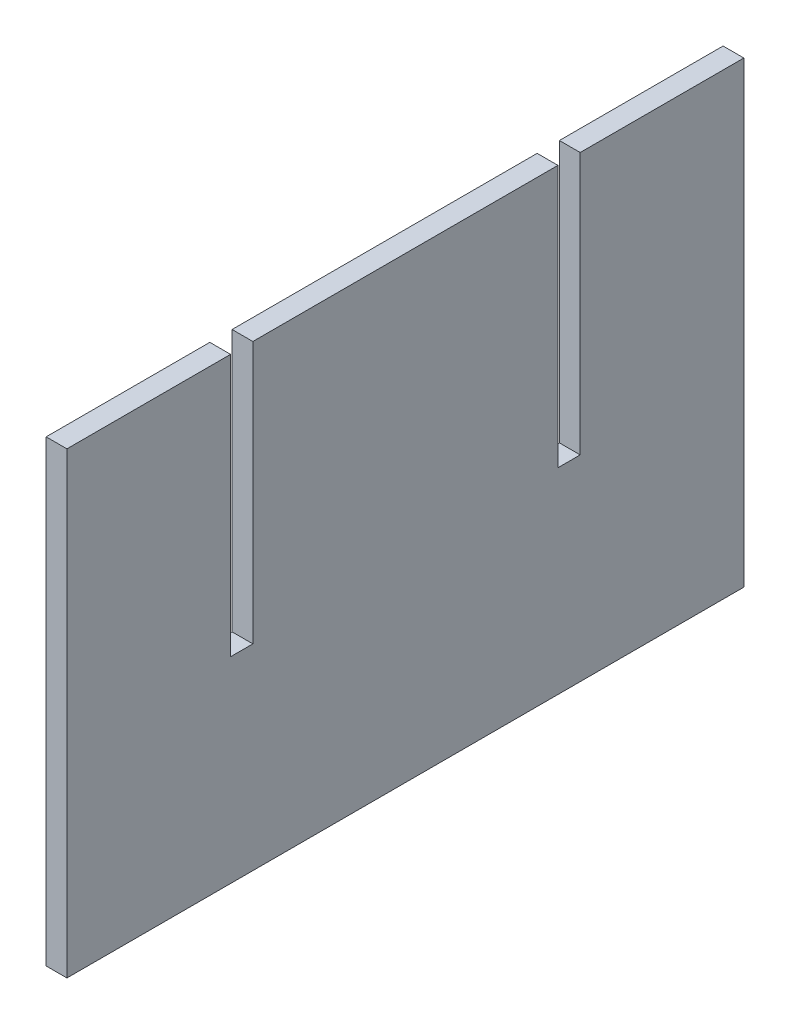
ISO-10303-21;
HEADER;
FILE_DESCRIPTION(('STEP AP214'),'2;1');
FILE_NAME('part.step','',(''),(''),'','','');
FILE_SCHEMA(('AUTOMOTIVE_DESIGN { 1 0 10303 214 1 1 1 1 }'));
ENDSEC;
DATA;
#1=APPLICATION_CONTEXT('core data for automotive mechanical design processes');
#2=APPLICATION_PROTOCOL_DEFINITION('international standard','automotive_design',2000,#1);
#3=PRODUCT_CONTEXT('',#1,'mechanical');
#4=PRODUCT('Part','Part','',(#3));
#5=PRODUCT_RELATED_PRODUCT_CATEGORY('part','',(#4));
#6=PRODUCT_DEFINITION_FORMATION('','',#4);
#7=PRODUCT_DEFINITION_CONTEXT('part definition',#1,'design');
#8=PRODUCT_DEFINITION('design','',#6,#7);
#9=PRODUCT_DEFINITION_SHAPE('','',#8);
#10=(LENGTH_UNIT() NAMED_UNIT(*) SI_UNIT(.MILLI.,.METRE.));
#11=(NAMED_UNIT(*) PLANE_ANGLE_UNIT() SI_UNIT($,.RADIAN.));
#12=(NAMED_UNIT(*) SI_UNIT($,.STERADIAN.) SOLID_ANGLE_UNIT());
#13=UNCERTAINTY_MEASURE_WITH_UNIT(LENGTH_MEASURE(1.E-05),#10,'distance_accuracy_value','');
#14=(GEOMETRIC_REPRESENTATION_CONTEXT(3) GLOBAL_UNCERTAINTY_ASSIGNED_CONTEXT((#13)) GLOBAL_UNIT_ASSIGNED_CONTEXT((#10,
#11,#12)) REPRESENTATION_CONTEXT('',''));
#15=CARTESIAN_POINT('',(0.,0.,0.));
#16=DIRECTION('',(0.,0.,1.));
#17=DIRECTION('',(1.,0.,0.));
#18=AXIS2_PLACEMENT_3D('',#15,#16,#17);
#19=CARTESIAN_POINT('',(3.175,0.,-103.4));
#20=DIRECTION('',(0.,1.,0.));
#21=DIRECTION('',(0.,0.,1.));
#22=AXIS2_PLACEMENT_3D('',#19,#20,#21);
#23=PLANE('',#22);
#24=DIRECTION('',(0.,0.,-1.));
#25=VECTOR('',#24,1.);
#26=CARTESIAN_POINT('',(0.,0.,-103.4));
#27=LINE('',#26,#25);
#28=CARTESIAN_POINT('',(0.,0.,0.));
#29=VERTEX_POINT('',#28);
#30=CARTESIAN_POINT('',(0.,0.,-103.4));
#31=VERTEX_POINT('',#30);
#32=EDGE_CURVE('E153',#29,#31,#27,.T.);
#33=ORIENTED_EDGE('',*,*,#32,.T.);
#34=DIRECTION('',(-1.,0.,0.));
#35=VECTOR('',#34,1.);
#36=CARTESIAN_POINT('',(3.175,0.,-103.4));
#37=LINE('',#36,#35);
#38=CARTESIAN_POINT('',(3.175,0.,-103.4));
#39=VERTEX_POINT('',#38);
#40=EDGE_CURVE('E11',#39,#31,#37,.T.);
#41=ORIENTED_EDGE('',*,*,#40,.F.);
#42=DIRECTION('',(0.,0.,-1.));
#43=VECTOR('',#42,1.);
#44=CARTESIAN_POINT('',(3.175,0.,-103.4));
#45=LINE('',#44,#43);
#46=CARTESIAN_POINT('',(3.175,0.,0.));
#47=VERTEX_POINT('',#46);
#48=EDGE_CURVE('E175',#47,#39,#45,.T.);
#49=ORIENTED_EDGE('',*,*,#48,.F.);
#50=DIRECTION('',(-1.,0.,0.));
#51=VECTOR('',#50,1.);
#52=CARTESIAN_POINT('',(3.175,0.,0.));
#53=LINE('',#52,#51);
#54=EDGE_CURVE('E149',#47,#29,#53,.T.);
#55=ORIENTED_EDGE('',*,*,#54,.T.);
#56=EDGE_LOOP('',(#33,#41,#49,#55));
#57=FACE_BOUND('',#56,.T.);
#58=ADVANCED_FACE('F33',(#57),#23,.F.);
#59=CARTESIAN_POINT('',(3.175,70.,-103.4));
#60=DIRECTION('',(0.,0.,1.));
#61=DIRECTION('',(1.,0.,0.));
#62=AXIS2_PLACEMENT_3D('',#59,#60,#61);
#63=PLANE('',#62);
#64=DIRECTION('',(0.,1.,0.));
#65=VECTOR('',#64,1.);
#66=CARTESIAN_POINT('',(0.,70.,-103.4));
#67=LINE('',#66,#65);
#68=CARTESIAN_POINT('',(0.,70.,-103.4));
#69=VERTEX_POINT('',#68);
#70=EDGE_CURVE('E156',#31,#69,#67,.T.);
#71=ORIENTED_EDGE('',*,*,#70,.T.);
#72=DIRECTION('',(-1.,0.,0.));
#73=VECTOR('',#72,1.);
#74=CARTESIAN_POINT('',(3.175,70.,-103.4));
#75=LINE('',#74,#73);
#76=CARTESIAN_POINT('',(3.175,70.,-103.4));
#77=VERTEX_POINT('',#76);
#78=EDGE_CURVE('E41',#77,#69,#75,.T.);
#79=ORIENTED_EDGE('',*,*,#78,.F.);
#80=DIRECTION('',(0.,1.,0.));
#81=VECTOR('',#80,1.);
#82=CARTESIAN_POINT('',(3.175,70.,-103.4));
#83=LINE('',#82,#81);
#84=EDGE_CURVE('E104',#39,#77,#83,.T.);
#85=ORIENTED_EDGE('',*,*,#84,.F.);
#86=ORIENTED_EDGE('',*,*,#40,.T.);
#87=EDGE_LOOP('',(#71,#79,#85,#86));
#88=FACE_BOUND('',#87,.T.);
#89=ADVANCED_FACE('F253',(#88),#63,.F.);
#90=CARTESIAN_POINT('',(3.175,70.,-78.4));
#91=DIRECTION('',(0.,-1.,0.));
#92=DIRECTION('',(0.,0.,-1.));
#93=AXIS2_PLACEMENT_3D('',#90,#91,#92);
#94=PLANE('',#93);
#95=DIRECTION('',(0.,0.,1.));
#96=VECTOR('',#95,1.);
#97=CARTESIAN_POINT('',(0.,70.,-78.4));
#98=LINE('',#97,#96);
#99=CARTESIAN_POINT('',(0.,70.,-78.4));
#100=VERTEX_POINT('',#99);
#101=EDGE_CURVE('E158',#69,#100,#98,.T.);
#102=ORIENTED_EDGE('',*,*,#101,.T.);
#103=DIRECTION('',(-1.,0.,0.));
#104=VECTOR('',#103,1.);
#105=CARTESIAN_POINT('',(3.175,70.,-78.4));
#106=LINE('',#105,#104);
#107=CARTESIAN_POINT('',(3.175,70.,-78.4));
#108=VERTEX_POINT('',#107);
#109=EDGE_CURVE('E194',#108,#100,#106,.T.);
#110=ORIENTED_EDGE('',*,*,#109,.F.);
#111=DIRECTION('',(0.,0.,1.));
#112=VECTOR('',#111,1.);
#113=CARTESIAN_POINT('',(3.175,70.,-78.4));
#114=LINE('',#113,#112);
#115=EDGE_CURVE('E202',#77,#108,#114,.T.);
#116=ORIENTED_EDGE('',*,*,#115,.F.);
#117=ORIENTED_EDGE('',*,*,#78,.T.);
#118=EDGE_LOOP('',(#102,#110,#116,#117));
#119=FACE_BOUND('',#118,.T.);
#120=ADVANCED_FACE('F200',(#119),#94,.F.);
#121=CARTESIAN_POINT('',(3.175,30.,-78.4));
#122=DIRECTION('',(0.,0.,-1.));
#123=DIRECTION('',(-1.,0.,0.));
#124=AXIS2_PLACEMENT_3D('',#121,#122,#123);
#125=PLANE('',#124);
#126=DIRECTION('',(0.,-1.,0.));
#127=VECTOR('',#126,1.);
#128=CARTESIAN_POINT('',(0.,30.,-78.4));
#129=LINE('',#128,#127);
#130=CARTESIAN_POINT('',(0.,30.,-78.4));
#131=VERTEX_POINT('',#130);
#132=EDGE_CURVE('E160',#100,#131,#129,.T.);
#133=ORIENTED_EDGE('',*,*,#132,.T.);
#134=DIRECTION('',(-1.,0.,0.));
#135=VECTOR('',#134,1.);
#136=CARTESIAN_POINT('',(3.175,30.,-78.4));
#137=LINE('',#136,#135);
#138=CARTESIAN_POINT('',(3.175,30.,-78.4));
#139=VERTEX_POINT('',#138);
#140=EDGE_CURVE('E191',#139,#131,#137,.T.);
#141=ORIENTED_EDGE('',*,*,#140,.F.);
#142=DIRECTION('',(0.,-1.,0.));
#143=VECTOR('',#142,1.);
#144=CARTESIAN_POINT('',(3.175,30.,-78.4));
#145=LINE('',#144,#143);
#146=EDGE_CURVE('E220',#108,#139,#145,.T.);
#147=ORIENTED_EDGE('',*,*,#146,.F.);
#148=ORIENTED_EDGE('',*,*,#109,.T.);
#149=EDGE_LOOP('',(#133,#141,#147,#148));
#150=FACE_BOUND('',#149,.T.);
#151=ADVANCED_FACE('F211',(#150),#125,.F.);
#152=CARTESIAN_POINT('',(3.175,30.,-75.));
#153=DIRECTION('',(0.,-1.,0.));
#154=DIRECTION('',(0.,0.,-1.));
#155=AXIS2_PLACEMENT_3D('',#152,#153,#154);
#156=PLANE('',#155);
#157=DIRECTION('',(0.,0.,1.));
#158=VECTOR('',#157,1.);
#159=CARTESIAN_POINT('',(0.,30.,-75.));
#160=LINE('',#159,#158);
#161=CARTESIAN_POINT('',(0.,30.,-75.));
#162=VERTEX_POINT('',#161);
#163=EDGE_CURVE('E162',#131,#162,#160,.T.);
#164=ORIENTED_EDGE('',*,*,#163,.T.);
#165=DIRECTION('',(-1.,0.,0.));
#166=VECTOR('',#165,1.);
#167=CARTESIAN_POINT('',(3.175,30.,-75.));
#168=LINE('',#167,#166);
#169=CARTESIAN_POINT('',(3.175,30.,-75.));
#170=VERTEX_POINT('',#169);
#171=EDGE_CURVE('E188',#170,#162,#168,.T.);
#172=ORIENTED_EDGE('',*,*,#171,.F.);
#173=DIRECTION('',(0.,0.,1.));
#174=VECTOR('',#173,1.);
#175=CARTESIAN_POINT('',(3.175,30.,-75.));
#176=LINE('',#175,#174);
#177=EDGE_CURVE('E217',#139,#170,#176,.T.);
#178=ORIENTED_EDGE('',*,*,#177,.F.);
#179=ORIENTED_EDGE('',*,*,#140,.T.);
#180=EDGE_LOOP('',(#164,#172,#178,#179));
#181=FACE_BOUND('',#180,.T.);
#182=ADVANCED_FACE('F215',(#181),#156,.F.);
#183=CARTESIAN_POINT('',(3.175,70.,-75.));
#184=DIRECTION('',(0.,0.,1.));
#185=DIRECTION('',(1.,0.,0.));
#186=AXIS2_PLACEMENT_3D('',#183,#184,#185);
#187=PLANE('',#186);
#188=DIRECTION('',(0.,1.,0.));
#189=VECTOR('',#188,1.);
#190=CARTESIAN_POINT('',(0.,70.,-75.));
#191=LINE('',#190,#189);
#192=CARTESIAN_POINT('',(0.,70.,-75.));
#193=VERTEX_POINT('',#192);
#194=EDGE_CURVE('E164',#162,#193,#191,.T.);
#195=ORIENTED_EDGE('',*,*,#194,.T.);
#196=DIRECTION('',(-1.,0.,0.));
#197=VECTOR('',#196,1.);
#198=CARTESIAN_POINT('',(3.175,70.,-75.));
#199=LINE('',#198,#197);
#200=CARTESIAN_POINT('',(3.175,70.,-75.));
#201=VERTEX_POINT('',#200);
#202=EDGE_CURVE('E185',#201,#193,#199,.T.);
#203=ORIENTED_EDGE('',*,*,#202,.F.);
#204=DIRECTION('',(0.,1.,0.));
#205=VECTOR('',#204,1.);
#206=CARTESIAN_POINT('',(3.175,70.,-75.));
#207=LINE('',#206,#205);
#208=EDGE_CURVE('E219',#170,#201,#207,.T.);
#209=ORIENTED_EDGE('',*,*,#208,.F.);
#210=ORIENTED_EDGE('',*,*,#171,.T.);
#211=EDGE_LOOP('',(#195,#203,#209,#210));
#212=FACE_BOUND('',#211,.T.);
#213=ADVANCED_FACE('F266',(#212),#187,.F.);
#214=CARTESIAN_POINT('',(3.175,70.,-28.4));
#215=DIRECTION('',(0.,-1.,0.));
#216=DIRECTION('',(0.,0.,-1.));
#217=AXIS2_PLACEMENT_3D('',#214,#215,#216);
#218=PLANE('',#217);
#219=DIRECTION('',(0.,0.,1.));
#220=VECTOR('',#219,1.);
#221=CARTESIAN_POINT('',(0.,70.,-28.4));
#222=LINE('',#221,#220);
#223=CARTESIAN_POINT('',(0.,70.,-28.4));
#224=VERTEX_POINT('',#223);
#225=EDGE_CURVE('E166',#193,#224,#222,.T.);
#226=ORIENTED_EDGE('',*,*,#225,.T.);
#227=DIRECTION('',(-1.,0.,0.));
#228=VECTOR('',#227,1.);
#229=CARTESIAN_POINT('',(3.175,70.,-28.4));
#230=LINE('',#229,#228);
#231=CARTESIAN_POINT('',(3.175,70.,-28.4));
#232=VERTEX_POINT('',#231);
#233=EDGE_CURVE('E182',#232,#224,#230,.T.);
#234=ORIENTED_EDGE('',*,*,#233,.F.);
#235=DIRECTION('',(0.,0.,1.));
#236=VECTOR('',#235,1.);
#237=CARTESIAN_POINT('',(3.175,70.,-28.4));
#238=LINE('',#237,#236);
#239=EDGE_CURVE('E222',#201,#232,#238,.T.);
#240=ORIENTED_EDGE('',*,*,#239,.F.);
#241=ORIENTED_EDGE('',*,*,#202,.T.);
#242=EDGE_LOOP('',(#226,#234,#240,#241));
#243=FACE_BOUND('',#242,.T.);
#244=ADVANCED_FACE('F269',(#243),#218,.F.);
#245=CARTESIAN_POINT('',(3.175,30.,-28.4));
#246=DIRECTION('',(0.,0.,-1.));
#247=DIRECTION('',(0.,1.,0.));
#248=AXIS2_PLACEMENT_3D('',#245,#246,#247);
#249=PLANE('',#248);
#250=DIRECTION('',(0.,-1.,0.));
#251=VECTOR('',#250,1.);
#252=CARTESIAN_POINT('',(0.,30.,-28.4));
#253=LINE('',#252,#251);
#254=CARTESIAN_POINT('',(0.,30.,-28.4));
#255=VERTEX_POINT('',#254);
#256=EDGE_CURVE('E168',#224,#255,#253,.T.);
#257=ORIENTED_EDGE('',*,*,#256,.T.);
#258=DIRECTION('',(-1.,0.,0.));
#259=VECTOR('',#258,1.);
#260=CARTESIAN_POINT('',(3.175,30.,-28.4));
#261=LINE('',#260,#259);
#262=CARTESIAN_POINT('',(3.175,30.,-28.4));
#263=VERTEX_POINT('',#262);
#264=EDGE_CURVE('E179',#263,#255,#261,.T.);
#265=ORIENTED_EDGE('',*,*,#264,.F.);
#266=DIRECTION('',(0.,-1.,0.));
#267=VECTOR('',#266,1.);
#268=CARTESIAN_POINT('',(3.175,30.,-28.4));
#269=LINE('',#268,#267);
#270=EDGE_CURVE('E228',#232,#263,#269,.T.);
#271=ORIENTED_EDGE('',*,*,#270,.F.);
#272=ORIENTED_EDGE('',*,*,#233,.T.);
#273=EDGE_LOOP('',(#257,#265,#271,#272));
#274=FACE_BOUND('',#273,.T.);
#275=ADVANCED_FACE('F234',(#274),#249,.F.);
#276=CARTESIAN_POINT('',(3.175,30.,-25.));
#277=DIRECTION('',(0.,-1.,0.));
#278=DIRECTION('',(0.,0.,-1.));
#279=AXIS2_PLACEMENT_3D('',#276,#277,#278);
#280=PLANE('',#279);
#281=DIRECTION('',(0.,0.,1.));
#282=VECTOR('',#281,1.);
#283=CARTESIAN_POINT('',(0.,30.,-25.));
#284=LINE('',#283,#282);
#285=CARTESIAN_POINT('',(0.,30.,-25.));
#286=VERTEX_POINT('',#285);
#287=EDGE_CURVE('E170',#255,#286,#284,.T.);
#288=ORIENTED_EDGE('',*,*,#287,.T.);
#289=DIRECTION('',(-1.,0.,0.));
#290=VECTOR('',#289,1.);
#291=CARTESIAN_POINT('',(3.175,30.,-25.));
#292=LINE('',#291,#290);
#293=CARTESIAN_POINT('',(3.175,30.,-25.));
#294=VERTEX_POINT('',#293);
#295=EDGE_CURVE('E144',#294,#286,#292,.T.);
#296=ORIENTED_EDGE('',*,*,#295,.F.);
#297=DIRECTION('',(0.,0.,1.));
#298=VECTOR('',#297,1.);
#299=CARTESIAN_POINT('',(3.175,30.,-25.));
#300=LINE('',#299,#298);
#301=EDGE_CURVE('E135',#263,#294,#300,.T.);
#302=ORIENTED_EDGE('',*,*,#301,.F.);
#303=ORIENTED_EDGE('',*,*,#264,.T.);
#304=EDGE_LOOP('',(#288,#296,#302,#303));
#305=FACE_BOUND('',#304,.T.);
#306=ADVANCED_FACE('F238',(#305),#280,.F.);
#307=CARTESIAN_POINT('',(3.175,70.,-25.));
#308=DIRECTION('',(0.,0.,1.));
#309=DIRECTION('',(1.,0.,0.));
#310=AXIS2_PLACEMENT_3D('',#307,#308,#309);
#311=PLANE('',#310);
#312=DIRECTION('',(0.,1.,0.));
#313=VECTOR('',#312,1.);
#314=CARTESIAN_POINT('',(0.,70.,-25.));
#315=LINE('',#314,#313);
#316=CARTESIAN_POINT('',(0.,70.,-25.));
#317=VERTEX_POINT('',#316);
#318=EDGE_CURVE('E143',#286,#317,#315,.T.);
#319=ORIENTED_EDGE('',*,*,#318,.T.);
#320=DIRECTION('',(-1.,0.,0.));
#321=VECTOR('',#320,1.);
#322=CARTESIAN_POINT('',(3.175,70.,-25.));
#323=LINE('',#322,#321);
#324=CARTESIAN_POINT('',(3.175,70.,-25.));
#325=VERTEX_POINT('',#324);
#326=EDGE_CURVE('E140',#325,#317,#323,.T.);
#327=ORIENTED_EDGE('',*,*,#326,.F.);
#328=DIRECTION('',(0.,1.,0.));
#329=VECTOR('',#328,1.);
#330=CARTESIAN_POINT('',(3.175,70.,-25.));
#331=LINE('',#330,#329);
#332=EDGE_CURVE('E129',#294,#325,#331,.T.);
#333=ORIENTED_EDGE('',*,*,#332,.F.);
#334=ORIENTED_EDGE('',*,*,#295,.T.);
#335=EDGE_LOOP('',(#319,#327,#333,#334));
#336=FACE_BOUND('',#335,.T.);
#337=ADVANCED_FACE('F141',(#336),#311,.F.);
#338=CARTESIAN_POINT('',(3.175,70.,0.));
#339=DIRECTION('',(0.,-1.,0.));
#340=DIRECTION('',(0.,0.,-1.));
#341=AXIS2_PLACEMENT_3D('',#338,#339,#340);
#342=PLANE('',#341);
#343=DIRECTION('',(0.,0.,1.));
#344=VECTOR('',#343,1.);
#345=CARTESIAN_POINT('',(0.,70.,0.));
#346=LINE('',#345,#344);
#347=CARTESIAN_POINT('',(0.,70.,0.));
#348=VERTEX_POINT('',#347);
#349=EDGE_CURVE('E90',#317,#348,#346,.T.);
#350=ORIENTED_EDGE('',*,*,#349,.T.);
#351=DIRECTION('',(-1.,0.,0.));
#352=VECTOR('',#351,1.);
#353=CARTESIAN_POINT('',(3.175,70.,0.));
#354=LINE('',#353,#352);
#355=CARTESIAN_POINT('',(3.175,70.,0.));
#356=VERTEX_POINT('',#355);
#357=EDGE_CURVE('E145',#356,#348,#354,.T.);
#358=ORIENTED_EDGE('',*,*,#357,.F.);
#359=DIRECTION('',(0.,0.,1.));
#360=VECTOR('',#359,1.);
#361=CARTESIAN_POINT('',(3.175,70.,0.));
#362=LINE('',#361,#360);
#363=EDGE_CURVE('E133',#325,#356,#362,.T.);
#364=ORIENTED_EDGE('',*,*,#363,.F.);
#365=ORIENTED_EDGE('',*,*,#326,.T.);
#366=EDGE_LOOP('',(#350,#358,#364,#365));
#367=FACE_BOUND('',#366,.T.);
#368=ADVANCED_FACE('F147',(#367),#342,.F.);
#369=CARTESIAN_POINT('',(3.175,0.,0.));
#370=DIRECTION('',(0.,0.,-1.));
#371=DIRECTION('',(-1.,0.,0.));
#372=AXIS2_PLACEMENT_3D('',#369,#370,#371);
#373=PLANE('',#372);
#374=DIRECTION('',(0.,-1.,0.));
#375=VECTOR('',#374,1.);
#376=CARTESIAN_POINT('',(0.,0.,0.));
#377=LINE('',#376,#375);
#378=EDGE_CURVE('E96',#348,#29,#377,.T.);
#379=ORIENTED_EDGE('',*,*,#378,.T.);
#380=ORIENTED_EDGE('',*,*,#54,.F.);
#381=DIRECTION('',(0.,-1.,0.));
#382=VECTOR('',#381,1.);
#383=CARTESIAN_POINT('',(3.175,0.,0.));
#384=LINE('',#383,#382);
#385=EDGE_CURVE('E49',#356,#47,#384,.T.);
#386=ORIENTED_EDGE('',*,*,#385,.F.);
#387=ORIENTED_EDGE('',*,*,#357,.T.);
#388=EDGE_LOOP('',(#379,#380,#386,#387));
#389=FACE_BOUND('',#388,.T.);
#390=ADVANCED_FACE('F242',(#389),#373,.F.);
#391=CARTESIAN_POINT('',(3.175,0.,0.));
#392=DIRECTION('',(-1.,0.,0.));
#393=DIRECTION('',(0.,0.,1.));
#394=AXIS2_PLACEMENT_3D('',#391,#392,#393);
#395=PLANE('',#394);
#396=ORIENTED_EDGE('',*,*,#48,.T.);
#397=ORIENTED_EDGE('',*,*,#84,.T.);
#398=ORIENTED_EDGE('',*,*,#115,.T.);
#399=ORIENTED_EDGE('',*,*,#146,.T.);
#400=ORIENTED_EDGE('',*,*,#177,.T.);
#401=ORIENTED_EDGE('',*,*,#208,.T.);
#402=ORIENTED_EDGE('',*,*,#239,.T.);
#403=ORIENTED_EDGE('',*,*,#270,.T.);
#404=ORIENTED_EDGE('',*,*,#301,.T.);
#405=ORIENTED_EDGE('',*,*,#332,.T.);
#406=ORIENTED_EDGE('',*,*,#363,.T.);
#407=ORIENTED_EDGE('',*,*,#385,.T.);
#408=EDGE_LOOP('',(#396,#397,#398,#399,#400,#401,#402,#403,#404,#405,#406,#407));
#409=FACE_BOUND('',#408,.T.);
#410=ADVANCED_FACE('F131',(#409),#395,.F.);
#411=CARTESIAN_POINT('',(0.,0.,0.));
#412=DIRECTION('',(-1.,0.,0.));
#413=DIRECTION('',(0.,0.,1.));
#414=AXIS2_PLACEMENT_3D('',#411,#412,#413);
#415=PLANE('',#414);
#416=ORIENTED_EDGE('',*,*,#32,.F.);
#417=ORIENTED_EDGE('',*,*,#378,.F.);
#418=ORIENTED_EDGE('',*,*,#349,.F.);
#419=ORIENTED_EDGE('',*,*,#318,.F.);
#420=ORIENTED_EDGE('',*,*,#287,.F.);
#421=ORIENTED_EDGE('',*,*,#256,.F.);
#422=ORIENTED_EDGE('',*,*,#225,.F.);
#423=ORIENTED_EDGE('',*,*,#194,.F.);
#424=ORIENTED_EDGE('',*,*,#163,.F.);
#425=ORIENTED_EDGE('',*,*,#132,.F.);
#426=ORIENTED_EDGE('',*,*,#101,.F.);
#427=ORIENTED_EDGE('',*,*,#70,.F.);
#428=EDGE_LOOP('',(#416,#417,#418,#419,#420,#421,#422,#423,#424,#425,#426,#427));
#429=FACE_BOUND('',#428,.T.);
#430=ADVANCED_FACE('F206',(#429),#415,.T.);
#431=CLOSED_SHELL('',(#58,#89,#120,#151,#182,#213,#244,#275,#306,#337,#368,#390,#410,#430));
#432=MANIFOLD_SOLID_BREP('B2',#431);
#433=ADVANCED_BREP_SHAPE_REPRESENTATION('',(#18,#432),#14);
#434=SHAPE_DEFINITION_REPRESENTATION(#9,#433);
ENDSEC;
END-ISO-10303-21;
